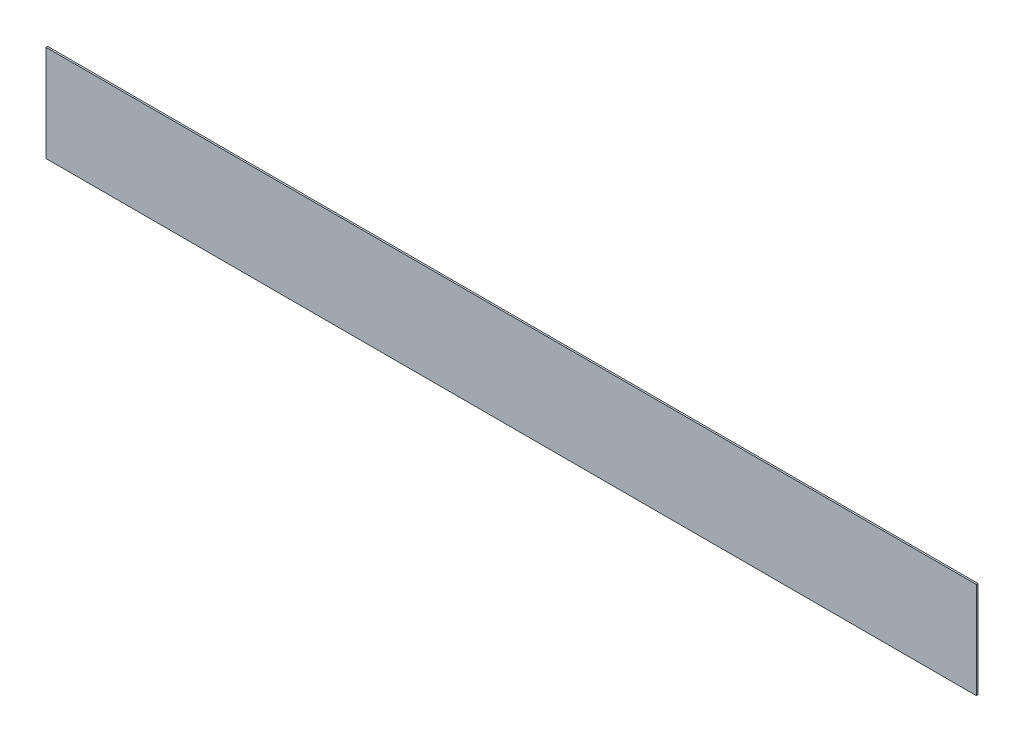
ISO-10303-21;
HEADER;
FILE_DESCRIPTION(('STEP AP214'),'2;1');
FILE_NAME('part.step','',(''),(''),'','','');
FILE_SCHEMA(('AUTOMOTIVE_DESIGN { 1 0 10303 214 1 1 1 1 }'));
ENDSEC;
DATA;
#1=APPLICATION_CONTEXT('core data for automotive mechanical design processes');
#2=APPLICATION_PROTOCOL_DEFINITION('international standard','automotive_design',2000,#1);
#3=PRODUCT_CONTEXT('',#1,'mechanical');
#4=PRODUCT('Part','Part','',(#3));
#5=PRODUCT_RELATED_PRODUCT_CATEGORY('part','',(#4));
#6=PRODUCT_DEFINITION_FORMATION('','',#4);
#7=PRODUCT_DEFINITION_CONTEXT('part definition',#1,'design');
#8=PRODUCT_DEFINITION('design','',#6,#7);
#9=PRODUCT_DEFINITION_SHAPE('','',#8);
#10=(LENGTH_UNIT() NAMED_UNIT(*) SI_UNIT(.MILLI.,.METRE.));
#11=(NAMED_UNIT(*) PLANE_ANGLE_UNIT() SI_UNIT($,.RADIAN.));
#12=(NAMED_UNIT(*) SI_UNIT($,.STERADIAN.) SOLID_ANGLE_UNIT());
#13=UNCERTAINTY_MEASURE_WITH_UNIT(LENGTH_MEASURE(1.E-05),#10,'distance_accuracy_value','');
#14=(GEOMETRIC_REPRESENTATION_CONTEXT(3) GLOBAL_UNCERTAINTY_ASSIGNED_CONTEXT((#13)) GLOBAL_UNIT_ASSIGNED_CONTEXT((#10,
#11,#12)) REPRESENTATION_CONTEXT('',''));
#15=CARTESIAN_POINT('',(0.,0.,0.));
#16=DIRECTION('',(0.,0.,1.));
#17=DIRECTION('',(1.,0.,0.));
#18=AXIS2_PLACEMENT_3D('',#15,#16,#17);
#19=CARTESIAN_POINT('',(0.,0.,1.27));
#20=DIRECTION('',(1.,0.,0.));
#21=DIRECTION('',(0.,0.,-1.));
#22=AXIS2_PLACEMENT_3D('',#19,#20,#21);
#23=PLANE('',#22);
#24=DIRECTION('',(0.,-1.,0.));
#25=VECTOR('',#24,1.);
#26=CARTESIAN_POINT('',(0.,0.,0.));
#27=LINE('',#26,#25);
#28=CARTESIAN_POINT('',(0.,72.46,0.));
#29=VERTEX_POINT('',#28);
#30=CARTESIAN_POINT('',(0.,0.,0.));
#31=VERTEX_POINT('',#30);
#32=EDGE_CURVE('E102',#29,#31,#27,.T.);
#33=ORIENTED_EDGE('',*,*,#32,.T.);
#34=DIRECTION('',(0.,0.,-1.));
#35=VECTOR('',#34,1.);
#36=CARTESIAN_POINT('',(0.,0.,1.27));
#37=LINE('',#36,#35);
#38=CARTESIAN_POINT('',(0.,0.,1.27));
#39=VERTEX_POINT('',#38);
#40=EDGE_CURVE('E11',#39,#31,#37,.T.);
#41=ORIENTED_EDGE('',*,*,#40,.F.);
#42=DIRECTION('',(0.,-1.,0.));
#43=VECTOR('',#42,1.);
#44=CARTESIAN_POINT('',(0.,0.,1.27));
#45=LINE('',#44,#43);
#46=CARTESIAN_POINT('',(0.,72.46,1.27));
#47=VERTEX_POINT('',#46);
#48=EDGE_CURVE('E90',#47,#39,#45,.T.);
#49=ORIENTED_EDGE('',*,*,#48,.F.);
#50=DIRECTION('',(0.,0.,-1.));
#51=VECTOR('',#50,1.);
#52=CARTESIAN_POINT('',(0.,72.46,1.27));
#53=LINE('',#52,#51);
#54=EDGE_CURVE('E98',#47,#29,#53,.T.);
#55=ORIENTED_EDGE('',*,*,#54,.T.);
#56=EDGE_LOOP('',(#33,#41,#49,#55));
#57=FACE_BOUND('',#56,.T.);
#58=ADVANCED_FACE('F39',(#57),#23,.F.);
#59=CARTESIAN_POINT('',(0.,0.,1.27));
#60=DIRECTION('',(0.,1.,0.));
#61=DIRECTION('',(0.,0.,1.));
#62=AXIS2_PLACEMENT_3D('',#59,#60,#61);
#63=PLANE('',#62);
#64=DIRECTION('',(1.,0.,0.));
#65=VECTOR('',#64,1.);
#66=CARTESIAN_POINT('',(0.,0.,0.));
#67=LINE('',#66,#65);
#68=CARTESIAN_POINT('',(700.,0.,0.));
#69=VERTEX_POINT('',#68);
#70=EDGE_CURVE('E94',#31,#69,#67,.T.);
#71=ORIENTED_EDGE('',*,*,#70,.T.);
#72=DIRECTION('',(0.,0.,-1.));
#73=VECTOR('',#72,1.);
#74=CARTESIAN_POINT('',(700.,0.,1.27));
#75=LINE('',#74,#73);
#76=CARTESIAN_POINT('',(700.,0.,1.27));
#77=VERTEX_POINT('',#76);
#78=EDGE_CURVE('E47',#77,#69,#75,.T.);
#79=ORIENTED_EDGE('',*,*,#78,.F.);
#80=DIRECTION('',(1.,0.,0.));
#81=VECTOR('',#80,1.);
#82=CARTESIAN_POINT('',(0.,0.,1.27));
#83=LINE('',#82,#81);
#84=EDGE_CURVE('E85',#39,#77,#83,.T.);
#85=ORIENTED_EDGE('',*,*,#84,.F.);
#86=ORIENTED_EDGE('',*,*,#40,.T.);
#87=EDGE_LOOP('',(#71,#79,#85,#86));
#88=FACE_BOUND('',#87,.T.);
#89=ADVANCED_FACE('F93',(#88),#63,.F.);
#90=CARTESIAN_POINT('',(700.,0.,1.27));
#91=DIRECTION('',(-1.,0.,0.));
#92=DIRECTION('',(0.,0.,1.));
#93=AXIS2_PLACEMENT_3D('',#90,#91,#92);
#94=PLANE('',#93);
#95=DIRECTION('',(0.,1.,0.));
#96=VECTOR('',#95,1.);
#97=CARTESIAN_POINT('',(700.,0.,0.));
#98=LINE('',#97,#96);
#99=CARTESIAN_POINT('',(700.,72.46,0.));
#100=VERTEX_POINT('',#99);
#101=EDGE_CURVE('E72',#69,#100,#98,.T.);
#102=ORIENTED_EDGE('',*,*,#101,.T.);
#103=DIRECTION('',(0.,0.,-1.));
#104=VECTOR('',#103,1.);
#105=CARTESIAN_POINT('',(700.,72.46,1.27));
#106=LINE('',#105,#104);
#107=CARTESIAN_POINT('',(700.,72.46,1.27));
#108=VERTEX_POINT('',#107);
#109=EDGE_CURVE('E95',#108,#100,#106,.T.);
#110=ORIENTED_EDGE('',*,*,#109,.F.);
#111=DIRECTION('',(0.,1.,0.));
#112=VECTOR('',#111,1.);
#113=CARTESIAN_POINT('',(700.,0.,1.27));
#114=LINE('',#113,#112);
#115=EDGE_CURVE('E88',#77,#108,#114,.T.);
#116=ORIENTED_EDGE('',*,*,#115,.F.);
#117=ORIENTED_EDGE('',*,*,#78,.T.);
#118=EDGE_LOOP('',(#102,#110,#116,#117));
#119=FACE_BOUND('',#118,.T.);
#120=ADVANCED_FACE('F96',(#119),#94,.F.);
#121=CARTESIAN_POINT('',(0.,72.46,1.27));
#122=DIRECTION('',(0.,-1.,0.));
#123=DIRECTION('',(0.,0.,-1.));
#124=AXIS2_PLACEMENT_3D('',#121,#122,#123);
#125=PLANE('',#124);
#126=DIRECTION('',(-1.,0.,0.));
#127=VECTOR('',#126,1.);
#128=CARTESIAN_POINT('',(0.,72.46,0.));
#129=LINE('',#128,#127);
#130=EDGE_CURVE('E78',#100,#29,#129,.T.);
#131=ORIENTED_EDGE('',*,*,#130,.T.);
#132=ORIENTED_EDGE('',*,*,#54,.F.);
#133=DIRECTION('',(-1.,0.,0.));
#134=VECTOR('',#133,1.);
#135=CARTESIAN_POINT('',(0.,72.46,1.27));
#136=LINE('',#135,#134);
#137=EDGE_CURVE('E55',#108,#47,#136,.T.);
#138=ORIENTED_EDGE('',*,*,#137,.F.);
#139=ORIENTED_EDGE('',*,*,#109,.T.);
#140=EDGE_LOOP('',(#131,#132,#138,#139));
#141=FACE_BOUND('',#140,.T.);
#142=ADVANCED_FACE('F109',(#141),#125,.F.);
#143=CARTESIAN_POINT('',(0.,0.,1.27));
#144=DIRECTION('',(0.,0.,-1.));
#145=DIRECTION('',(-1.,0.,0.));
#146=AXIS2_PLACEMENT_3D('',#143,#144,#145);
#147=PLANE('',#146);
#148=ORIENTED_EDGE('',*,*,#48,.T.);
#149=ORIENTED_EDGE('',*,*,#84,.T.);
#150=ORIENTED_EDGE('',*,*,#115,.T.);
#151=ORIENTED_EDGE('',*,*,#137,.T.);
#152=EDGE_LOOP('',(#148,#149,#150,#151));
#153=FACE_BOUND('',#152,.T.);
#154=ADVANCED_FACE('F86',(#153),#147,.F.);
#155=CARTESIAN_POINT('',(0.,0.,0.));
#156=DIRECTION('',(0.,0.,-1.));
#157=DIRECTION('',(-1.,0.,0.));
#158=AXIS2_PLACEMENT_3D('',#155,#156,#157);
#159=PLANE('',#158);
#160=ORIENTED_EDGE('',*,*,#32,.F.);
#161=ORIENTED_EDGE('',*,*,#130,.F.);
#162=ORIENTED_EDGE('',*,*,#101,.F.);
#163=ORIENTED_EDGE('',*,*,#70,.F.);
#164=EDGE_LOOP('',(#160,#161,#162,#163));
#165=FACE_BOUND('',#164,.T.);
#166=ADVANCED_FACE('F112',(#165),#159,.T.);
#167=CLOSED_SHELL('',(#58,#89,#120,#142,#154,#166));
#168=MANIFOLD_SOLID_BREP('B2',#167);
#169=ADVANCED_BREP_SHAPE_REPRESENTATION('',(#18,#168),#14);
#170=SHAPE_DEFINITION_REPRESENTATION(#9,#169);
ENDSEC;
END-ISO-10303-21;
